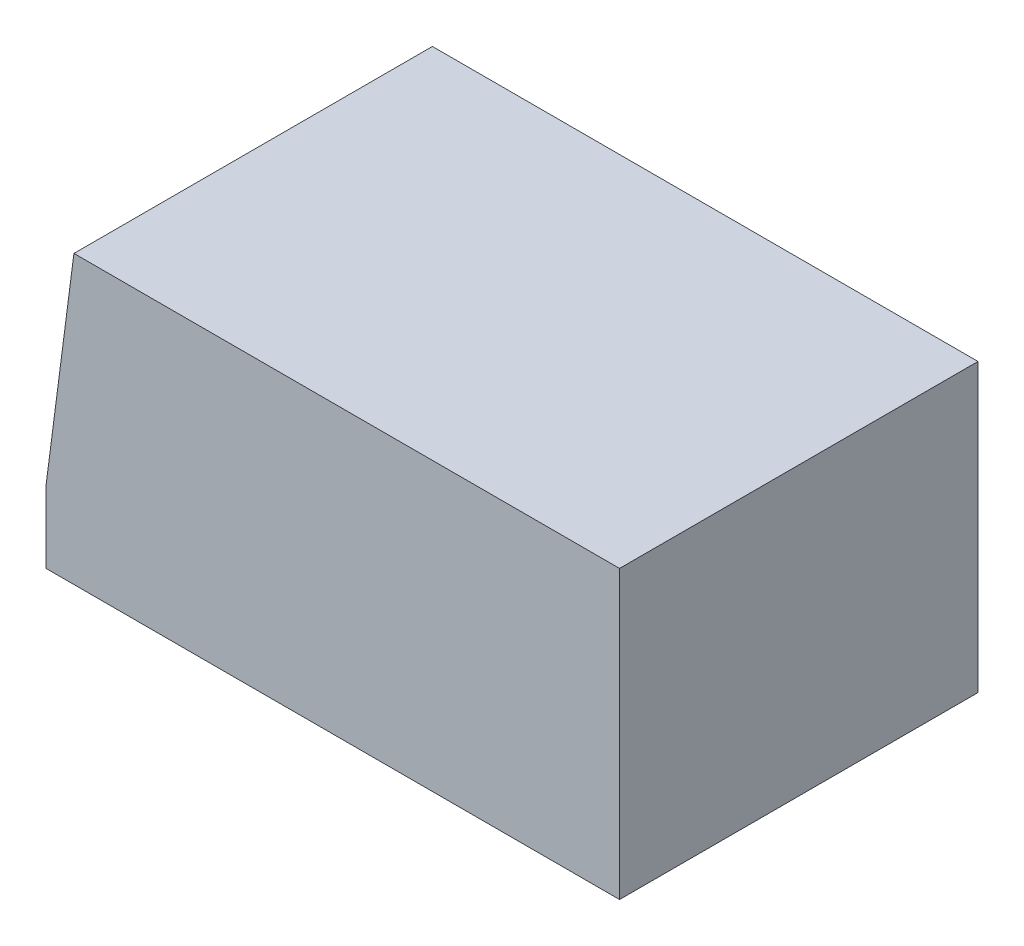
ISO-10303-21;
HEADER;
FILE_DESCRIPTION(('STEP AP214'),'2;1');
FILE_NAME('part.step','',(''),(''),'','','');
FILE_SCHEMA(('AUTOMOTIVE_DESIGN { 1 0 10303 214 1 1 1 1 }'));
ENDSEC;
DATA;
#1=APPLICATION_CONTEXT('core data for automotive mechanical design processes');
#2=APPLICATION_PROTOCOL_DEFINITION('international standard','automotive_design',2000,#1);
#3=PRODUCT_CONTEXT('',#1,'mechanical');
#4=PRODUCT('Part','Part','',(#3));
#5=PRODUCT_RELATED_PRODUCT_CATEGORY('part','',(#4));
#6=PRODUCT_DEFINITION_FORMATION('','',#4);
#7=PRODUCT_DEFINITION_CONTEXT('part definition',#1,'design');
#8=PRODUCT_DEFINITION('design','',#6,#7);
#9=PRODUCT_DEFINITION_SHAPE('','',#8);
#10=(LENGTH_UNIT() NAMED_UNIT(*) SI_UNIT(.MILLI.,.METRE.));
#11=(NAMED_UNIT(*) PLANE_ANGLE_UNIT() SI_UNIT($,.RADIAN.));
#12=(NAMED_UNIT(*) SI_UNIT($,.STERADIAN.) SOLID_ANGLE_UNIT());
#13=UNCERTAINTY_MEASURE_WITH_UNIT(LENGTH_MEASURE(1.E-05),#10,'distance_accuracy_value','');
#14=(GEOMETRIC_REPRESENTATION_CONTEXT(3) GLOBAL_UNCERTAINTY_ASSIGNED_CONTEXT((#13)) GLOBAL_UNIT_ASSIGNED_CONTEXT((#10,
#11,#12)) REPRESENTATION_CONTEXT('',''));
#15=CARTESIAN_POINT('',(0.,0.,0.));
#16=DIRECTION('',(0.,0.,1.));
#17=DIRECTION('',(1.,0.,0.));
#18=AXIS2_PLACEMENT_3D('',#15,#16,#17);
#19=CARTESIAN_POINT('',(40.,40.,25.));
#20=DIRECTION('',(-1.,0.,0.));
#21=DIRECTION('',(0.,0.,1.));
#22=AXIS2_PLACEMENT_3D('',#19,#20,#21);
#23=PLANE('',#22);
#24=DIRECTION('',(0.,0.,-1.));
#25=VECTOR('',#24,1.);
#26=CARTESIAN_POINT('',(40.,0.,25.));
#27=LINE('',#26,#25);
#28=CARTESIAN_POINT('',(40.,0.,25.));
#29=VERTEX_POINT('',#28);
#30=CARTESIAN_POINT('',(40.,0.,-25.));
#31=VERTEX_POINT('',#30);
#32=EDGE_CURVE('E99',#29,#31,#27,.T.);
#33=ORIENTED_EDGE('',*,*,#32,.T.);
#34=DIRECTION('',(0.,-1.,0.));
#35=VECTOR('',#34,1.);
#36=CARTESIAN_POINT('',(40.,40.,-25.));
#37=LINE('',#36,#35);
#38=CARTESIAN_POINT('',(40.,40.,-25.));
#39=VERTEX_POINT('',#38);
#40=EDGE_CURVE('E82',#39,#31,#37,.T.);
#41=ORIENTED_EDGE('',*,*,#40,.F.);
#42=DIRECTION('',(0.,0.,-1.));
#43=VECTOR('',#42,1.);
#44=CARTESIAN_POINT('',(40.,40.,25.));
#45=LINE('',#44,#43);
#46=CARTESIAN_POINT('',(40.,40.,25.));
#47=VERTEX_POINT('',#46);
#48=EDGE_CURVE('E89',#47,#39,#45,.T.);
#49=ORIENTED_EDGE('',*,*,#48,.F.);
#50=DIRECTION('',(0.,-1.,0.));
#51=VECTOR('',#50,1.);
#52=CARTESIAN_POINT('',(40.,40.,25.));
#53=LINE('',#52,#51);
#54=EDGE_CURVE('E109',#47,#29,#53,.T.);
#55=ORIENTED_EDGE('',*,*,#54,.T.);
#56=EDGE_LOOP('',(#33,#41,#49,#55));
#57=FACE_BOUND('',#56,.T.);
#58=ADVANCED_FACE('F32',(#57),#23,.F.);
#59=CARTESIAN_POINT('',(-40.,40.,-25.));
#60=DIRECTION('',(0.,0.,1.));
#61=DIRECTION('',(1.,0.,0.));
#62=AXIS2_PLACEMENT_3D('',#59,#60,#61);
#63=PLANE('',#62);
#64=DIRECTION('',(0.,-1.,0.));
#65=VECTOR('',#64,1.);
#66=CARTESIAN_POINT('',(-40.,40.,-25.));
#67=LINE('',#66,#65);
#68=CARTESIAN_POINT('',(-40.,9.99999999999921,-25.));
#69=VERTEX_POINT('',#68);
#70=CARTESIAN_POINT('',(-40.,0.,-25.));
#71=VERTEX_POINT('',#70);
#72=EDGE_CURVE('E101',#69,#71,#67,.T.);
#73=ORIENTED_EDGE('',*,*,#72,.F.);
#74=DIRECTION('',(-0.12879559657756,-0.991671162383091,0.));
#75=VECTOR('',#74,1.);
#76=CARTESIAN_POINT('',(-36.1036802884924,40.,-25.));
#77=LINE('',#76,#75);
#78=CARTESIAN_POINT('',(-36.1036802884924,40.,-25.));
#79=VERTEX_POINT('',#78);
#80=EDGE_CURVE('E11',#69,#79,#77,.F.);
#81=ORIENTED_EDGE('',*,*,#80,.T.);
#82=DIRECTION('',(-1.,0.,0.));
#83=VECTOR('',#82,1.);
#84=CARTESIAN_POINT('',(-40.,40.,-25.));
#85=LINE('',#84,#83);
#86=EDGE_CURVE('E77',#39,#79,#85,.T.);
#87=ORIENTED_EDGE('',*,*,#86,.F.);
#88=ORIENTED_EDGE('',*,*,#40,.T.);
#89=DIRECTION('',(-1.,0.,0.));
#90=VECTOR('',#89,1.);
#91=CARTESIAN_POINT('',(-40.,0.,-25.));
#92=LINE('',#91,#90);
#93=EDGE_CURVE('E115',#31,#71,#92,.T.);
#94=ORIENTED_EDGE('',*,*,#93,.T.);
#95=EDGE_LOOP('',(#73,#81,#87,#88,#94));
#96=FACE_BOUND('',#95,.T.);
#97=ADVANCED_FACE('F79',(#96),#63,.F.);
#98=CARTESIAN_POINT('',(-40.,40.,25.));
#99=DIRECTION('',(1.,0.,0.));
#100=DIRECTION('',(0.,0.,-1.));
#101=AXIS2_PLACEMENT_3D('',#98,#99,#100);
#102=PLANE('',#101);
#103=DIRECTION('',(0.,-1.,0.));
#104=VECTOR('',#103,1.);
#105=CARTESIAN_POINT('',(-40.,40.,25.));
#106=LINE('',#105,#104);
#107=CARTESIAN_POINT('',(-40.,9.99999999999921,25.));
#108=VERTEX_POINT('',#107);
#109=CARTESIAN_POINT('',(-40.,0.,25.));
#110=VERTEX_POINT('',#109);
#111=EDGE_CURVE('E104',#108,#110,#106,.T.);
#112=ORIENTED_EDGE('',*,*,#111,.F.);
#113=DIRECTION('',(0.,0.,-1.));
#114=VECTOR('',#113,1.);
#115=CARTESIAN_POINT('',(-40.,9.99999999999921,25.));
#116=LINE('',#115,#114);
#117=EDGE_CURVE('E40',#108,#69,#116,.T.);
#118=ORIENTED_EDGE('',*,*,#117,.T.);
#119=ORIENTED_EDGE('',*,*,#72,.T.);
#120=DIRECTION('',(0.,0.,1.));
#121=VECTOR('',#120,1.);
#122=CARTESIAN_POINT('',(-40.,0.,25.));
#123=LINE('',#122,#121);
#124=EDGE_CURVE('E112',#71,#110,#123,.T.);
#125=ORIENTED_EDGE('',*,*,#124,.T.);
#126=EDGE_LOOP('',(#112,#118,#119,#125));
#127=FACE_BOUND('',#126,.T.);
#128=ADVANCED_FACE('F141',(#127),#102,.F.);
#129=CARTESIAN_POINT('',(-40.,40.,25.));
#130=DIRECTION('',(0.,0.,-1.));
#131=DIRECTION('',(-1.,0.,0.));
#132=AXIS2_PLACEMENT_3D('',#129,#130,#131);
#133=PLANE('',#132);
#134=DIRECTION('',(1.,0.,0.));
#135=VECTOR('',#134,1.);
#136=CARTESIAN_POINT('',(-40.,40.,25.));
#137=LINE('',#136,#135);
#138=CARTESIAN_POINT('',(-36.1036802884924,40.,25.));
#139=VERTEX_POINT('',#138);
#140=EDGE_CURVE('E88',#139,#47,#137,.T.);
#141=ORIENTED_EDGE('',*,*,#140,.F.);
#142=DIRECTION('',(0.12879559657756,0.991671162383091,0.));
#143=VECTOR('',#142,1.);
#144=CARTESIAN_POINT('',(-36.1036802884924,40.,25.));
#145=LINE('',#144,#143);
#146=EDGE_CURVE('E54',#139,#108,#145,.F.);
#147=ORIENTED_EDGE('',*,*,#146,.T.);
#148=ORIENTED_EDGE('',*,*,#111,.T.);
#149=DIRECTION('',(1.,0.,0.));
#150=VECTOR('',#149,1.);
#151=CARTESIAN_POINT('',(-40.,0.,25.));
#152=LINE('',#151,#150);
#153=EDGE_CURVE('E96',#110,#29,#152,.T.);
#154=ORIENTED_EDGE('',*,*,#153,.T.);
#155=ORIENTED_EDGE('',*,*,#54,.F.);
#156=EDGE_LOOP('',(#141,#147,#148,#154,#155));
#157=FACE_BOUND('',#156,.T.);
#158=ADVANCED_FACE('F137',(#157),#133,.F.);
#159=CARTESIAN_POINT('',(0.,40.,0.));
#160=DIRECTION('',(0.,-1.,0.));
#161=DIRECTION('',(0.,0.,-1.));
#162=AXIS2_PLACEMENT_3D('',#159,#160,#161);
#163=PLANE('',#162);
#164=ORIENTED_EDGE('',*,*,#86,.T.);
#165=DIRECTION('',(0.,0.,1.));
#166=VECTOR('',#165,1.);
#167=CARTESIAN_POINT('',(-36.1036802884924,40.,0.));
#168=LINE('',#167,#166);
#169=EDGE_CURVE('E100',#79,#139,#168,.T.);
#170=ORIENTED_EDGE('',*,*,#169,.T.);
#171=ORIENTED_EDGE('',*,*,#140,.T.);
#172=ORIENTED_EDGE('',*,*,#48,.T.);
#173=EDGE_LOOP('',(#164,#170,#171,#172));
#174=FACE_BOUND('',#173,.T.);
#175=ADVANCED_FACE('F92',(#174),#163,.F.);
#176=CARTESIAN_POINT('',(0.,0.,0.));
#177=DIRECTION('',(0.,-1.,0.));
#178=DIRECTION('',(0.,0.,-1.));
#179=AXIS2_PLACEMENT_3D('',#176,#177,#178);
#180=PLANE('',#179);
#181=ORIENTED_EDGE('',*,*,#32,.F.);
#182=ORIENTED_EDGE('',*,*,#153,.F.);
#183=ORIENTED_EDGE('',*,*,#124,.F.);
#184=ORIENTED_EDGE('',*,*,#93,.F.);
#185=EDGE_LOOP('',(#181,#182,#183,#184));
#186=FACE_BOUND('',#185,.T.);
#187=ADVANCED_FACE('F136',(#186),#180,.T.);
#188=CARTESIAN_POINT('',(-36.1036802884924,40.,0.));
#189=DIRECTION('',(0.991671162383091,-0.12879559657756,0.));
#190=DIRECTION('',(0.,0.,1.));
#191=AXIS2_PLACEMENT_3D('',#188,#189,#190);
#192=PLANE('',#191);
#193=CARTESIAN_POINT('',(-38.1896286421072,23.9390873332021,0.));
#194=DIRECTION('',(-0.991671162383091,0.12879559657756,0.));
#195=DIRECTION('',(-0.12879559657756,-0.991671162383091,0.));
#196=AXIS2_PLACEMENT_3D('',#193,#194,#195);
#197=CIRCLE('',#196,12.5);
#198=CARTESIAN_POINT('',(-39.7995735993267,11.5431978034134,0.));
#199=VERTEX_POINT('',#198);
#200=EDGE_CURVE('E120',#199,#199,#197,.T.);
#201=ORIENTED_EDGE('',*,*,#200,.F.);
#202=EDGE_LOOP('',(#201));
#203=FACE_BOUND('',#202,.T.);
#204=ORIENTED_EDGE('',*,*,#80,.F.);
#205=ORIENTED_EDGE('',*,*,#117,.F.);
#206=ORIENTED_EDGE('',*,*,#146,.F.);
#207=ORIENTED_EDGE('',*,*,#169,.F.);
#208=EDGE_LOOP('',(#204,#205,#206,#207));
#209=FACE_BOUND('',#208,.T.);
#210=ADVANCED_FACE('F34',(#203,#209),#192,.F.);
#211=CARTESIAN_POINT('',(1.4772178532164,18.7872634700997,0.));
#212=DIRECTION('',(-0.991671162383091,0.12879559657756,0.));
#213=DIRECTION('',(-0.12879559657756,-0.991671162383091,0.));
#214=AXIS2_PLACEMENT_3D('',#211,#212,#213);
#215=CYLINDRICAL_SURFACE('',#214,12.5);
#216=CARTESIAN_POINT('',(1.4772178532164,18.7872634700997,0.));
#217=DIRECTION('',(-0.991671162383091,0.12879559657756,0.));
#218=DIRECTION('',(-0.12879559657756,-0.991671162383091,0.));
#219=AXIS2_PLACEMENT_3D('',#216,#217,#218);
#220=CIRCLE('',#219,12.5);
#221=CARTESIAN_POINT('',(-0.132727104003098,6.39137394031104,0.));
#222=VERTEX_POINT('',#221);
#223=EDGE_CURVE('E118',#222,#222,#220,.T.);
#224=ORIENTED_EDGE('',*,*,#223,.F.);
#225=EDGE_LOOP('',(#224));
#226=FACE_BOUND('',#225,.T.);
#227=ORIENTED_EDGE('',*,*,#200,.T.);
#228=EDGE_LOOP('',(#227));
#229=FACE_BOUND('',#228,.T.);
#230=ADVANCED_FACE('F128',(#226,#229),#215,.F.);
#231=CARTESIAN_POINT('',(1.4772178532164,18.7872634700997,0.));
#232=DIRECTION('',(-0.991671162383091,0.12879559657756,0.));
#233=DIRECTION('',(-0.12879559657756,-0.991671162383091,0.));
#234=AXIS2_PLACEMENT_3D('',#231,#232,#233);
#235=PLANE('',#234);
#236=ORIENTED_EDGE('',*,*,#223,.T.);
#237=EDGE_LOOP('',(#236));
#238=FACE_BOUND('',#237,.T.);
#239=ADVANCED_FACE('F126',(#238),#235,.T.);
#240=CLOSED_SHELL('',(#58,#97,#128,#158,#175,#187,#210,#230,#239));
#241=MANIFOLD_SOLID_BREP('B2',#240);
#242=ADVANCED_BREP_SHAPE_REPRESENTATION('',(#18,#241),#14);
#243=SHAPE_DEFINITION_REPRESENTATION(#9,#242);
ENDSEC;
END-ISO-10303-21;
